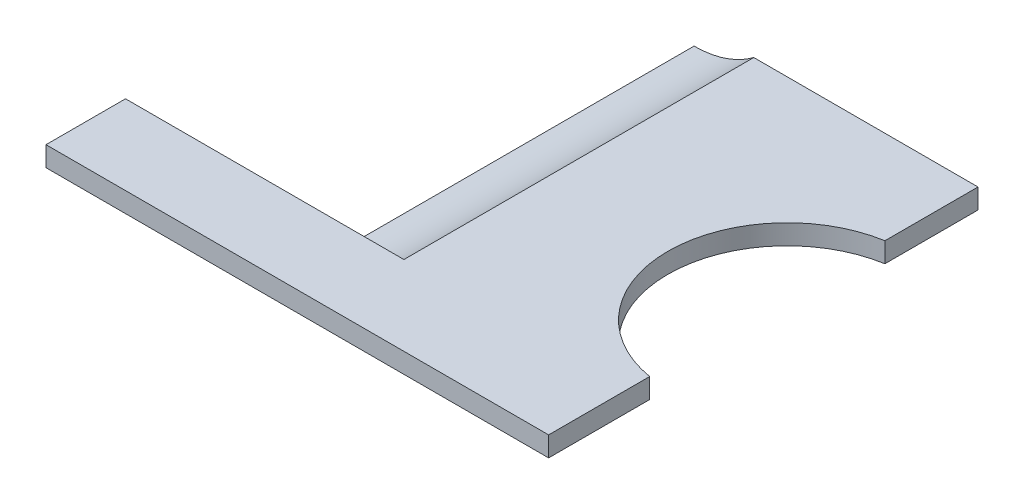
ISO-10303-21;
HEADER;
FILE_DESCRIPTION(('STEP AP214'),'2;1');
FILE_NAME('part.step','',(''),(''),'','','');
FILE_SCHEMA(('AUTOMOTIVE_DESIGN { 1 0 10303 214 1 1 1 1 }'));
ENDSEC;
DATA;
#1=APPLICATION_CONTEXT('core data for automotive mechanical design processes');
#2=APPLICATION_PROTOCOL_DEFINITION('international standard','automotive_design',2000,#1);
#3=PRODUCT_CONTEXT('',#1,'mechanical');
#4=PRODUCT('Part','Part','',(#3));
#5=PRODUCT_RELATED_PRODUCT_CATEGORY('part','',(#4));
#6=PRODUCT_DEFINITION_FORMATION('','',#4);
#7=PRODUCT_DEFINITION_CONTEXT('part definition',#1,'design');
#8=PRODUCT_DEFINITION('design','',#6,#7);
#9=PRODUCT_DEFINITION_SHAPE('','',#8);
#10=(LENGTH_UNIT() NAMED_UNIT(*) SI_UNIT(.MILLI.,.METRE.));
#11=(NAMED_UNIT(*) PLANE_ANGLE_UNIT() SI_UNIT($,.RADIAN.));
#12=(NAMED_UNIT(*) SI_UNIT($,.STERADIAN.) SOLID_ANGLE_UNIT());
#13=UNCERTAINTY_MEASURE_WITH_UNIT(LENGTH_MEASURE(1.E-05),#10,'distance_accuracy_value','');
#14=(GEOMETRIC_REPRESENTATION_CONTEXT(3) GLOBAL_UNCERTAINTY_ASSIGNED_CONTEXT((#13)) GLOBAL_UNIT_ASSIGNED_CONTEXT((#10,
#11,#12)) REPRESENTATION_CONTEXT('',''));
#15=CARTESIAN_POINT('',(0.,0.,0.));
#16=DIRECTION('',(0.,0.,1.));
#17=DIRECTION('',(1.,0.,0.));
#18=AXIS2_PLACEMENT_3D('',#15,#16,#17);
#19=CARTESIAN_POINT('',(7.14238409228308,0.,2.));
#20=DIRECTION('',(1.,0.,0.));
#21=DIRECTION('',(0.,0.,-1.));
#22=AXIS2_PLACEMENT_3D('',#19,#20,#21);
#23=PLANE('',#22);
#24=DIRECTION('',(0.,-1.,0.));
#25=VECTOR('',#24,1.);
#26=CARTESIAN_POINT('',(7.14238409228308,7.5,-0.54196010845019));
#27=LINE('',#26,#25);
#28=CARTESIAN_POINT('',(7.14238409228308,-1.99786515548299,-0.54196010845019));
#29=VERTEX_POINT('',#28);
#30=CARTESIAN_POINT('',(7.14238409228308,-2.5,-0.54196010845019));
#31=VERTEX_POINT('',#30);
#32=EDGE_CURVE('E106',#29,#31,#27,.T.);
#33=ORIENTED_EDGE('',*,*,#32,.F.);
#34=DIRECTION('',(0.,0.,-1.));
#35=VECTOR('',#34,1.);
#36=CARTESIAN_POINT('',(7.14238409228308,-1.99786515548299,2.));
#37=LINE('',#36,#35);
#38=CARTESIAN_POINT('',(7.14238409228308,-1.99786515548299,2.));
#39=VERTEX_POINT('',#38);
#40=EDGE_CURVE('E132',#39,#29,#37,.T.);
#41=ORIENTED_EDGE('',*,*,#40,.F.);
#42=DIRECTION('',(0.,-1.,0.));
#43=VECTOR('',#42,1.);
#44=CARTESIAN_POINT('',(7.14238409228308,0.,2.));
#45=LINE('',#44,#43);
#46=CARTESIAN_POINT('',(7.14238409228308,-2.5,2.));
#47=VERTEX_POINT('',#46);
#48=EDGE_CURVE('E127',#39,#47,#45,.T.);
#49=ORIENTED_EDGE('',*,*,#48,.T.);
#50=DIRECTION('',(0.,0.,-1.));
#51=VECTOR('',#50,1.);
#52=CARTESIAN_POINT('',(7.14238409228308,-2.5,2.));
#53=LINE('',#52,#51);
#54=EDGE_CURVE('E119',#47,#31,#53,.T.);
#55=ORIENTED_EDGE('',*,*,#54,.T.);
#56=EDGE_LOOP('',(#33,#41,#49,#55));
#57=FACE_BOUND('',#56,.T.);
#58=ADVANCED_FACE('F41',(#57),#23,.T.);
#59=CARTESIAN_POINT('',(0.,-2.5,2.));
#60=DIRECTION('',(0.,-1.,0.));
#61=DIRECTION('',(1.,0.,0.));
#62=AXIS2_PLACEMENT_3D('',#59,#60,#61);
#63=PLANE('',#62);
#64=CARTESIAN_POINT('',(7.64238409228308,-2.5,-3.5));
#65=DIRECTION('',(0.,-1.,0.));
#66=DIRECTION('',(1.,0.,0.));
#67=AXIS2_PLACEMENT_3D('',#64,#65,#66);
#68=CIRCLE('',#67,3.);
#69=CARTESIAN_POINT('',(7.14238409228308,-2.5,-6.45803989154981));
#70=VERTEX_POINT('',#69);
#71=EDGE_CURVE('E109',#31,#70,#68,.T.);
#72=ORIENTED_EDGE('',*,*,#71,.F.);
#73=ORIENTED_EDGE('',*,*,#54,.F.);
#74=DIRECTION('',(-1.,0.,0.));
#75=VECTOR('',#74,1.);
#76=CARTESIAN_POINT('',(0.,-2.5,2.));
#77=LINE('',#76,#75);
#78=CARTESIAN_POINT('',(-5.50000000000001,-2.5,2.));
#79=VERTEX_POINT('',#78);
#80=EDGE_CURVE('E148',#47,#79,#77,.T.);
#81=ORIENTED_EDGE('',*,*,#80,.T.);
#82=DIRECTION('',(0.,0.,-1.));
#83=VECTOR('',#82,1.);
#84=CARTESIAN_POINT('',(-5.50000000000001,-2.5,2.));
#85=LINE('',#84,#83);
#86=CARTESIAN_POINT('',(-5.50000000000001,-2.5,0.));
#87=VERTEX_POINT('',#86);
#88=EDGE_CURVE('E140',#79,#87,#85,.T.);
#89=ORIENTED_EDGE('',*,*,#88,.T.);
#90=DIRECTION('',(-1.,0.,0.));
#91=VECTOR('',#90,1.);
#92=CARTESIAN_POINT('',(0.,-2.5,0.));
#93=LINE('',#92,#91);
#94=CARTESIAN_POINT('',(0.,-2.5,0.));
#95=VERTEX_POINT('',#94);
#96=EDGE_CURVE('E151',#95,#87,#93,.T.);
#97=ORIENTED_EDGE('',*,*,#96,.F.);
#98=DIRECTION('',(0.,0.,1.));
#99=VECTOR('',#98,1.);
#100=CARTESIAN_POINT('',(0.,-2.5,-8.8));
#101=LINE('',#100,#99);
#102=CARTESIAN_POINT('',(0.,-2.5,-8.8));
#103=VERTEX_POINT('',#102);
#104=EDGE_CURVE('E165',#103,#95,#101,.T.);
#105=ORIENTED_EDGE('',*,*,#104,.F.);
#106=DIRECTION('',(1.,0.,0.));
#107=VECTOR('',#106,1.);
#108=CARTESIAN_POINT('',(7.14238409228308,-2.5,-8.8));
#109=LINE('',#108,#107);
#110=CARTESIAN_POINT('',(7.14238409228308,-2.5,-8.8));
#111=VERTEX_POINT('',#110);
#112=EDGE_CURVE('E180',#103,#111,#109,.T.);
#113=ORIENTED_EDGE('',*,*,#112,.T.);
#114=EDGE_CURVE('E122',#70,#111,#53,.T.);
#115=ORIENTED_EDGE('',*,*,#114,.F.);
#116=EDGE_LOOP('',(#72,#73,#81,#89,#97,#105,#113,#115));
#117=FACE_BOUND('',#116,.T.);
#118=ADVANCED_FACE('F43',(#117),#63,.T.);
#119=DIRECTION('',(0.,-1.,0.));
#120=VECTOR('',#119,1.);
#121=CARTESIAN_POINT('',(7.14238409228308,7.5,-6.45803989154981));
#122=LINE('',#121,#120);
#123=CARTESIAN_POINT('',(7.14238409228308,-1.99786515548299,-6.45803989154981));
#124=VERTEX_POINT('',#123);
#125=EDGE_CURVE('E56',#70,#124,#122,.F.);
#126=ORIENTED_EDGE('',*,*,#125,.F.);
#127=ORIENTED_EDGE('',*,*,#114,.T.);
#128=DIRECTION('',(0.,1.,0.));
#129=VECTOR('',#128,1.);
#130=CARTESIAN_POINT('',(7.14238409228308,-1.99786515548299,-8.8));
#131=LINE('',#130,#129);
#132=CARTESIAN_POINT('',(7.14238409228308,-1.99786515548299,-8.8));
#133=VERTEX_POINT('',#132);
#134=EDGE_CURVE('E176',#111,#133,#131,.T.);
#135=ORIENTED_EDGE('',*,*,#134,.T.);
#136=EDGE_CURVE('E136',#124,#133,#37,.T.);
#137=ORIENTED_EDGE('',*,*,#136,.F.);
#138=EDGE_LOOP('',(#126,#127,#135,#137));
#139=FACE_BOUND('',#138,.T.);
#140=ADVANCED_FACE('F194',(#139),#23,.T.);
#141=CARTESIAN_POINT('',(0.,-1.99786515548299,2.));
#142=DIRECTION('',(0.,1.,0.));
#143=DIRECTION('',(0.,0.,1.));
#144=AXIS2_PLACEMENT_3D('',#141,#142,#143);
#145=PLANE('',#144);
#146=CARTESIAN_POINT('',(7.64238409228308,-1.99786515548299,-3.5));
#147=DIRECTION('',(0.,1.,0.));
#148=DIRECTION('',(0.,0.,1.));
#149=AXIS2_PLACEMENT_3D('',#146,#147,#148);
#150=CIRCLE('',#149,3.);
#151=EDGE_CURVE('E11',#124,#29,#150,.T.);
#152=ORIENTED_EDGE('',*,*,#151,.F.);
#153=ORIENTED_EDGE('',*,*,#136,.T.);
#154=DIRECTION('',(-1.,0.,0.));
#155=VECTOR('',#154,1.);
#156=CARTESIAN_POINT('',(1.50284224737893,-1.99786515548299,-8.8));
#157=LINE('',#156,#155);
#158=CARTESIAN_POINT('',(1.50284224737893,-1.99786515548299,-8.8));
#159=VERTEX_POINT('',#158);
#160=EDGE_CURVE('E169',#133,#159,#157,.T.);
#161=ORIENTED_EDGE('',*,*,#160,.T.);
#162=DIRECTION('',(0.,0.,1.));
#163=VECTOR('',#162,1.);
#164=CARTESIAN_POINT('',(1.50284224737893,-1.99786515548299,-8.8));
#165=LINE('',#164,#163);
#166=CARTESIAN_POINT('',(1.50284224737893,-1.99786515548299,0.));
#167=VERTEX_POINT('',#166);
#168=EDGE_CURVE('E154',#159,#167,#165,.T.);
#169=ORIENTED_EDGE('',*,*,#168,.T.);
#170=DIRECTION('',(1.,0.,0.));
#171=VECTOR('',#170,1.);
#172=CARTESIAN_POINT('',(0.,-1.99786515548299,0.));
#173=LINE('',#172,#171);
#174=CARTESIAN_POINT('',(-5.50000000000001,-1.99786515548299,0.));
#175=VERTEX_POINT('',#174);
#176=EDGE_CURVE('E64',#175,#167,#173,.T.);
#177=ORIENTED_EDGE('',*,*,#176,.F.);
#178=DIRECTION('',(0.,0.,-1.));
#179=VECTOR('',#178,1.);
#180=CARTESIAN_POINT('',(-5.50000000000001,-1.99786515548299,2.));
#181=LINE('',#180,#179);
#182=CARTESIAN_POINT('',(-5.50000000000001,-1.99786515548299,2.));
#183=VERTEX_POINT('',#182);
#184=EDGE_CURVE('E137',#183,#175,#181,.T.);
#185=ORIENTED_EDGE('',*,*,#184,.F.);
#186=DIRECTION('',(1.,0.,0.));
#187=VECTOR('',#186,1.);
#188=CARTESIAN_POINT('',(0.,-1.99786515548299,2.));
#189=LINE('',#188,#187);
#190=EDGE_CURVE('E158',#183,#39,#189,.T.);
#191=ORIENTED_EDGE('',*,*,#190,.T.);
#192=ORIENTED_EDGE('',*,*,#40,.T.);
#193=EDGE_LOOP('',(#152,#153,#161,#169,#177,#185,#191,#192));
#194=FACE_BOUND('',#193,.T.);
#195=ADVANCED_FACE('F190',(#194),#145,.T.);
#196=CARTESIAN_POINT('',(-5.50000000000001,0.,2.));
#197=DIRECTION('',(-1.,0.,0.));
#198=DIRECTION('',(0.,0.,1.));
#199=AXIS2_PLACEMENT_3D('',#196,#197,#198);
#200=PLANE('',#199);
#201=DIRECTION('',(0.,1.,0.));
#202=VECTOR('',#201,1.);
#203=CARTESIAN_POINT('',(-5.50000000000001,0.,0.));
#204=LINE('',#203,#202);
#205=EDGE_CURVE('E145',#87,#175,#204,.T.);
#206=ORIENTED_EDGE('',*,*,#205,.F.);
#207=ORIENTED_EDGE('',*,*,#88,.F.);
#208=DIRECTION('',(0.,1.,0.));
#209=VECTOR('',#208,1.);
#210=CARTESIAN_POINT('',(-5.50000000000001,0.,2.));
#211=LINE('',#210,#209);
#212=EDGE_CURVE('E144',#79,#183,#211,.T.);
#213=ORIENTED_EDGE('',*,*,#212,.T.);
#214=ORIENTED_EDGE('',*,*,#184,.T.);
#215=EDGE_LOOP('',(#206,#207,#213,#214));
#216=FACE_BOUND('',#215,.T.);
#217=ADVANCED_FACE('F206',(#216),#200,.T.);
#218=CARTESIAN_POINT('',(0.,0.,2.));
#219=DIRECTION('',(0.,0.,1.));
#220=DIRECTION('',(1.,0.,0.));
#221=AXIS2_PLACEMENT_3D('',#218,#219,#220);
#222=PLANE('',#221);
#223=ORIENTED_EDGE('',*,*,#212,.F.);
#224=ORIENTED_EDGE('',*,*,#80,.F.);
#225=ORIENTED_EDGE('',*,*,#48,.F.);
#226=ORIENTED_EDGE('',*,*,#190,.F.);
#227=EDGE_LOOP('',(#223,#224,#225,#226));
#228=FACE_BOUND('',#227,.T.);
#229=ADVANCED_FACE('F209',(#228),#222,.T.);
#230=CARTESIAN_POINT('',(0.,0.,0.));
#231=DIRECTION('',(0.,0.,1.));
#232=DIRECTION('',(1.,0.,0.));
#233=AXIS2_PLACEMENT_3D('',#230,#231,#232);
#234=PLANE('',#233);
#235=ORIENTED_EDGE('',*,*,#176,.T.);
#236=CARTESIAN_POINT('',(0.,0.,0.));
#237=DIRECTION('',(0.,0.,1.));
#238=DIRECTION('',(1.,0.,0.));
#239=AXIS2_PLACEMENT_3D('',#236,#237,#238);
#240=CIRCLE('',#239,2.5);
#241=EDGE_CURVE('E50',#167,#95,#240,.F.);
#242=ORIENTED_EDGE('',*,*,#241,.T.);
#243=ORIENTED_EDGE('',*,*,#96,.T.);
#244=ORIENTED_EDGE('',*,*,#205,.T.);
#245=EDGE_LOOP('',(#235,#242,#243,#244));
#246=FACE_BOUND('',#245,.T.);
#247=ADVANCED_FACE('F203',(#246),#234,.F.);
#248=CARTESIAN_POINT('',(0.,0.,-8.8));
#249=DIRECTION('',(0.,0.,1.));
#250=DIRECTION('',(1.,0.,0.));
#251=AXIS2_PLACEMENT_3D('',#248,#249,#250);
#252=CYLINDRICAL_SURFACE('',#251,2.5);
#253=ORIENTED_EDGE('',*,*,#241,.F.);
#254=ORIENTED_EDGE('',*,*,#168,.F.);
#255=CARTESIAN_POINT('',(0.,0.,-8.8));
#256=DIRECTION('',(0.,0.,-1.));
#257=DIRECTION('',(1.,0.,0.));
#258=AXIS2_PLACEMENT_3D('',#255,#256,#257);
#259=CIRCLE('',#258,2.5);
#260=EDGE_CURVE('E115',#159,#103,#259,.T.);
#261=ORIENTED_EDGE('',*,*,#260,.T.);
#262=ORIENTED_EDGE('',*,*,#104,.T.);
#263=EDGE_LOOP('',(#253,#254,#261,#262));
#264=FACE_BOUND('',#263,.T.);
#265=ADVANCED_FACE('F200',(#264),#252,.F.);
#266=CARTESIAN_POINT('',(0.,0.,-8.8));
#267=DIRECTION('',(0.,0.,1.));
#268=DIRECTION('',(1.,0.,0.));
#269=AXIS2_PLACEMENT_3D('',#266,#267,#268);
#270=PLANE('',#269);
#271=ORIENTED_EDGE('',*,*,#260,.F.);
#272=ORIENTED_EDGE('',*,*,#160,.F.);
#273=ORIENTED_EDGE('',*,*,#134,.F.);
#274=ORIENTED_EDGE('',*,*,#112,.F.);
#275=EDGE_LOOP('',(#271,#272,#273,#274));
#276=FACE_BOUND('',#275,.T.);
#277=ADVANCED_FACE('F198',(#276),#270,.F.);
#278=CARTESIAN_POINT('',(7.64238409228308,7.5,-3.5));
#279=DIRECTION('',(0.,-1.,0.));
#280=DIRECTION('',(1.,0.,0.));
#281=AXIS2_PLACEMENT_3D('',#278,#279,#280);
#282=CYLINDRICAL_SURFACE('',#281,3.);
#283=ORIENTED_EDGE('',*,*,#32,.T.);
#284=ORIENTED_EDGE('',*,*,#71,.T.);
#285=ORIENTED_EDGE('',*,*,#125,.T.);
#286=ORIENTED_EDGE('',*,*,#151,.T.);
#287=EDGE_LOOP('',(#283,#284,#285,#286));
#288=FACE_BOUND('',#287,.T.);
#289=ADVANCED_FACE('F108',(#288),#282,.F.);
#290=CLOSED_SHELL('',(#58,#118,#140,#195,#217,#229,#247,#265,#277,#289));
#291=MANIFOLD_SOLID_BREP('B2',#290);
#292=ADVANCED_BREP_SHAPE_REPRESENTATION('',(#18,#291),#14);
#293=SHAPE_DEFINITION_REPRESENTATION(#9,#292);
ENDSEC;
END-ISO-10303-21;
